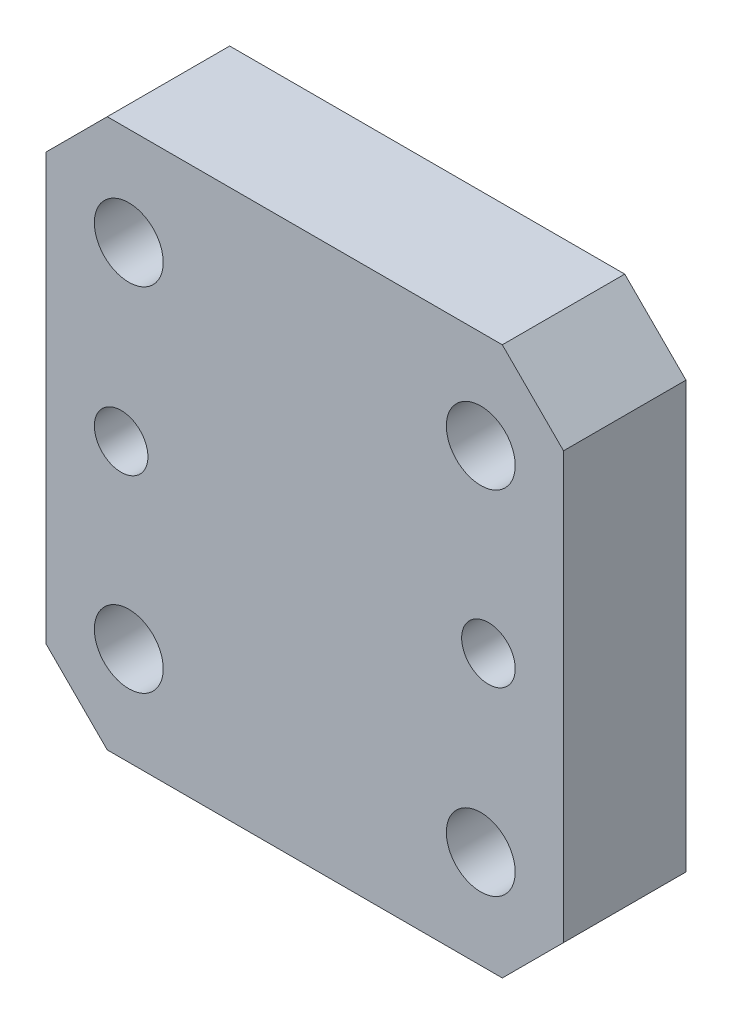
ISO-10303-21;
HEADER;
FILE_DESCRIPTION(('STEP AP214'),'2;1');
FILE_NAME('part.step','',(''),(''),'','','');
FILE_SCHEMA(('AUTOMOTIVE_DESIGN { 1 0 10303 214 1 1 1 1 }'));
ENDSEC;
DATA;
#1=APPLICATION_CONTEXT('core data for automotive mechanical design processes');
#2=APPLICATION_PROTOCOL_DEFINITION('international standard','automotive_design',2000,#1);
#3=PRODUCT_CONTEXT('',#1,'mechanical');
#4=PRODUCT('Part','Part','',(#3));
#5=PRODUCT_RELATED_PRODUCT_CATEGORY('part','',(#4));
#6=PRODUCT_DEFINITION_FORMATION('','',#4);
#7=PRODUCT_DEFINITION_CONTEXT('part definition',#1,'design');
#8=PRODUCT_DEFINITION('design','',#6,#7);
#9=PRODUCT_DEFINITION_SHAPE('','',#8);
#10=(LENGTH_UNIT() NAMED_UNIT(*) SI_UNIT(.MILLI.,.METRE.));
#11=(NAMED_UNIT(*) PLANE_ANGLE_UNIT() SI_UNIT($,.RADIAN.));
#12=(NAMED_UNIT(*) SI_UNIT($,.STERADIAN.) SOLID_ANGLE_UNIT());
#13=UNCERTAINTY_MEASURE_WITH_UNIT(LENGTH_MEASURE(1.E-05),#10,'distance_accuracy_value','');
#14=(GEOMETRIC_REPRESENTATION_CONTEXT(3) GLOBAL_UNCERTAINTY_ASSIGNED_CONTEXT((#13)) GLOBAL_UNIT_ASSIGNED_CONTEXT((#10,
#11,#12)) REPRESENTATION_CONTEXT('',''));
#15=CARTESIAN_POINT('',(0.,0.,0.));
#16=DIRECTION('',(0.,0.,1.));
#17=DIRECTION('',(1.,0.,0.));
#18=AXIS2_PLACEMENT_3D('',#15,#16,#17);
#19=CARTESIAN_POINT('',(-12.,0.,0.));
#20=DIRECTION('',(0.,0.,1.));
#21=DIRECTION('',(1.,0.,0.));
#22=AXIS2_PLACEMENT_3D('',#19,#20,#21);
#23=CYLINDRICAL_SURFACE('',#22,1.75);
#24=CARTESIAN_POINT('',(-12.,0.,8.));
#25=DIRECTION('',(0.,0.,1.));
#26=DIRECTION('',(1.,0.,0.));
#27=AXIS2_PLACEMENT_3D('',#24,#25,#26);
#28=CIRCLE('',#27,1.75);
#29=CARTESIAN_POINT('',(-10.25,0.,8.));
#30=VERTEX_POINT('',#29);
#31=EDGE_CURVE('E300',#30,#30,#28,.T.);
#32=ORIENTED_EDGE('',*,*,#31,.T.);
#33=EDGE_LOOP('',(#32));
#34=FACE_BOUND('',#33,.T.);
#35=CARTESIAN_POINT('',(-12.,0.,3.));
#36=DIRECTION('',(0.,0.,-1.));
#37=DIRECTION('',(-1.,0.,0.));
#38=AXIS2_PLACEMENT_3D('',#35,#36,#37);
#39=CIRCLE('',#38,1.75);
#40=CARTESIAN_POINT('',(-13.75,0.,3.));
#41=VERTEX_POINT('',#40);
#42=EDGE_CURVE('E37',#41,#41,#39,.F.);
#43=ORIENTED_EDGE('',*,*,#42,.F.);
#44=EDGE_LOOP('',(#43));
#45=FACE_BOUND('',#44,.T.);
#46=ADVANCED_FACE('F33',(#34,#45),#23,.F.);
#47=CARTESIAN_POINT('',(12.,0.,0.));
#48=DIRECTION('',(0.,0.,1.));
#49=DIRECTION('',(1.,0.,0.));
#50=AXIS2_PLACEMENT_3D('',#47,#48,#49);
#51=CYLINDRICAL_SURFACE('',#50,1.75);
#52=CARTESIAN_POINT('',(12.,0.,8.));
#53=DIRECTION('',(0.,0.,1.));
#54=DIRECTION('',(1.,0.,0.));
#55=AXIS2_PLACEMENT_3D('',#52,#53,#54);
#56=CIRCLE('',#55,1.75);
#57=CARTESIAN_POINT('',(13.75,0.,8.));
#58=VERTEX_POINT('',#57);
#59=EDGE_CURVE('E297',#58,#58,#56,.T.);
#60=ORIENTED_EDGE('',*,*,#59,.T.);
#61=EDGE_LOOP('',(#60));
#62=FACE_BOUND('',#61,.T.);
#63=CARTESIAN_POINT('',(12.,0.,3.));
#64=DIRECTION('',(0.,0.,-1.));
#65=DIRECTION('',(-1.,0.,0.));
#66=AXIS2_PLACEMENT_3D('',#63,#64,#65);
#67=CIRCLE('',#66,1.75);
#68=CARTESIAN_POINT('',(10.25,0.,3.));
#69=VERTEX_POINT('',#68);
#70=EDGE_CURVE('E263',#69,#69,#67,.F.);
#71=ORIENTED_EDGE('',*,*,#70,.F.);
#72=EDGE_LOOP('',(#71));
#73=FACE_BOUND('',#72,.T.);
#74=ADVANCED_FACE('F364',(#62,#73),#51,.F.);
#75=CARTESIAN_POINT('',(-16.9072825239631,17.9163073046844,8.));
#76=DIRECTION('',(1.,0.,0.));
#77=DIRECTION('',(0.,0.,-1.));
#78=AXIS2_PLACEMENT_3D('',#75,#76,#77);
#79=PLANE('',#78);
#80=DIRECTION('',(0.,-1.,0.));
#81=VECTOR('',#80,1.);
#82=CARTESIAN_POINT('',(-16.9072825239631,17.9163073046844,0.));
#83=LINE('',#82,#81);
#84=CARTESIAN_POINT('',(-16.9072825239631,13.9163073046844,0.));
#85=VERTEX_POINT('',#84);
#86=CARTESIAN_POINT('',(-16.9072825239631,-13.9163073046844,0.));
#87=VERTEX_POINT('',#86);
#88=EDGE_CURVE('E303',#85,#87,#83,.T.);
#89=ORIENTED_EDGE('',*,*,#88,.T.);
#90=DIRECTION('',(0.,0.,1.));
#91=VECTOR('',#90,1.);
#92=CARTESIAN_POINT('',(-16.9072825239631,-13.9163073046844,8.));
#93=LINE('',#92,#91);
#94=CARTESIAN_POINT('',(-16.9072825239631,-13.9163073046844,8.));
#95=VERTEX_POINT('',#94);
#96=EDGE_CURVE('E11',#87,#95,#93,.T.);
#97=ORIENTED_EDGE('',*,*,#96,.T.);
#98=DIRECTION('',(0.,-1.,0.));
#99=VECTOR('',#98,1.);
#100=CARTESIAN_POINT('',(-16.9072825239631,17.9163073046844,8.));
#101=LINE('',#100,#99);
#102=CARTESIAN_POINT('',(-16.9072825239631,13.9163073046844,8.));
#103=VERTEX_POINT('',#102);
#104=EDGE_CURVE('E304',#103,#95,#101,.T.);
#105=ORIENTED_EDGE('',*,*,#104,.F.);
#106=DIRECTION('',(0.,0.,-1.));
#107=VECTOR('',#106,1.);
#108=CARTESIAN_POINT('',(-16.9072825239631,13.9163073046844,8.));
#109=LINE('',#108,#107);
#110=EDGE_CURVE('E42',#103,#85,#109,.T.);
#111=ORIENTED_EDGE('',*,*,#110,.T.);
#112=EDGE_LOOP('',(#89,#97,#105,#111));
#113=FACE_BOUND('',#112,.T.);
#114=ADVANCED_FACE('F366',(#113),#79,.F.);
#115=CARTESIAN_POINT('',(16.9072825239631,-17.9163073046844,8.));
#116=DIRECTION('',(0.,1.,0.));
#117=DIRECTION('',(0.,0.,1.));
#118=AXIS2_PLACEMENT_3D('',#115,#116,#117);
#119=PLANE('',#118);
#120=DIRECTION('',(1.,0.,0.));
#121=VECTOR('',#120,1.);
#122=CARTESIAN_POINT('',(16.9072825239631,-17.9163073046844,0.));
#123=LINE('',#122,#121);
#124=CARTESIAN_POINT('',(-12.9072825239631,-17.9163073046844,0.));
#125=VERTEX_POINT('',#124);
#126=CARTESIAN_POINT('',(12.9072825239631,-17.9163073046844,0.));
#127=VERTEX_POINT('',#126);
#128=EDGE_CURVE('E320',#125,#127,#123,.T.);
#129=ORIENTED_EDGE('',*,*,#128,.T.);
#130=DIRECTION('',(0.,0.,1.));
#131=VECTOR('',#130,1.);
#132=CARTESIAN_POINT('',(12.9072825239631,-17.9163073046844,8.));
#133=LINE('',#132,#131);
#134=CARTESIAN_POINT('',(12.9072825239631,-17.9163073046844,8.));
#135=VERTEX_POINT('',#134);
#136=EDGE_CURVE('E356',#127,#135,#133,.T.);
#137=ORIENTED_EDGE('',*,*,#136,.T.);
#138=DIRECTION('',(1.,0.,0.));
#139=VECTOR('',#138,1.);
#140=CARTESIAN_POINT('',(16.9072825239631,-17.9163073046844,8.));
#141=LINE('',#140,#139);
#142=CARTESIAN_POINT('',(-12.9072825239631,-17.9163073046844,8.));
#143=VERTEX_POINT('',#142);
#144=EDGE_CURVE('E307',#143,#135,#141,.T.);
#145=ORIENTED_EDGE('',*,*,#144,.F.);
#146=DIRECTION('',(0.,0.,-1.));
#147=VECTOR('',#146,1.);
#148=CARTESIAN_POINT('',(-12.9072825239631,-17.9163073046844,8.));
#149=LINE('',#148,#147);
#150=EDGE_CURVE('E353',#143,#125,#149,.T.);
#151=ORIENTED_EDGE('',*,*,#150,.T.);
#152=EDGE_LOOP('',(#129,#137,#145,#151));
#153=FACE_BOUND('',#152,.T.);
#154=ADVANCED_FACE('F373',(#153),#119,.F.);
#155=CARTESIAN_POINT('',(16.9072825239631,17.9163073046844,8.));
#156=DIRECTION('',(-1.,0.,0.));
#157=DIRECTION('',(0.,0.,1.));
#158=AXIS2_PLACEMENT_3D('',#155,#156,#157);
#159=PLANE('',#158);
#160=DIRECTION('',(0.,1.,0.));
#161=VECTOR('',#160,1.);
#162=CARTESIAN_POINT('',(16.9072825239631,17.9163073046844,0.));
#163=LINE('',#162,#161);
#164=CARTESIAN_POINT('',(16.9072825239631,-13.9163073046844,0.));
#165=VERTEX_POINT('',#164);
#166=CARTESIAN_POINT('',(16.9072825239631,13.9163073046844,0.));
#167=VERTEX_POINT('',#166);
#168=EDGE_CURVE('E323',#165,#167,#163,.T.);
#169=ORIENTED_EDGE('',*,*,#168,.T.);
#170=DIRECTION('',(0.,0.,1.));
#171=VECTOR('',#170,1.);
#172=CARTESIAN_POINT('',(16.9072825239631,13.9163073046844,8.));
#173=LINE('',#172,#171);
#174=CARTESIAN_POINT('',(16.9072825239631,13.9163073046844,8.));
#175=VERTEX_POINT('',#174);
#176=EDGE_CURVE('E343',#167,#175,#173,.T.);
#177=ORIENTED_EDGE('',*,*,#176,.T.);
#178=DIRECTION('',(0.,1.,0.));
#179=VECTOR('',#178,1.);
#180=CARTESIAN_POINT('',(16.9072825239631,17.9163073046844,8.));
#181=LINE('',#180,#179);
#182=CARTESIAN_POINT('',(16.9072825239631,-13.9163073046844,8.));
#183=VERTEX_POINT('',#182);
#184=EDGE_CURVE('E311',#183,#175,#181,.T.);
#185=ORIENTED_EDGE('',*,*,#184,.F.);
#186=DIRECTION('',(0.,0.,-1.));
#187=VECTOR('',#186,1.);
#188=CARTESIAN_POINT('',(16.9072825239631,-13.9163073046844,8.));
#189=LINE('',#188,#187);
#190=EDGE_CURVE('E340',#183,#165,#189,.T.);
#191=ORIENTED_EDGE('',*,*,#190,.T.);
#192=EDGE_LOOP('',(#169,#177,#185,#191));
#193=FACE_BOUND('',#192,.T.);
#194=ADVANCED_FACE('F393',(#193),#159,.F.);
#195=CARTESIAN_POINT('',(16.9072825239631,17.9163073046844,8.));
#196=DIRECTION('',(0.,-1.,0.));
#197=DIRECTION('',(0.,0.,-1.));
#198=AXIS2_PLACEMENT_3D('',#195,#196,#197);
#199=PLANE('',#198);
#200=DIRECTION('',(-1.,0.,0.));
#201=VECTOR('',#200,1.);
#202=CARTESIAN_POINT('',(16.9072825239631,17.9163073046844,8.));
#203=LINE('',#202,#201);
#204=CARTESIAN_POINT('',(12.9072825239631,17.9163073046844,8.));
#205=VERTEX_POINT('',#204);
#206=CARTESIAN_POINT('',(-12.9072825239631,17.9163073046844,8.));
#207=VERTEX_POINT('',#206);
#208=EDGE_CURVE('E314',#205,#207,#203,.T.);
#209=ORIENTED_EDGE('',*,*,#208,.F.);
#210=DIRECTION('',(0.,0.,-1.));
#211=VECTOR('',#210,1.);
#212=CARTESIAN_POINT('',(12.9072825239631,17.9163073046844,8.));
#213=LINE('',#212,#211);
#214=CARTESIAN_POINT('',(12.9072825239631,17.9163073046844,0.));
#215=VERTEX_POINT('',#214);
#216=EDGE_CURVE('E329',#205,#215,#213,.T.);
#217=ORIENTED_EDGE('',*,*,#216,.T.);
#218=DIRECTION('',(-1.,0.,0.));
#219=VECTOR('',#218,1.);
#220=CARTESIAN_POINT('',(16.9072825239631,17.9163073046844,0.));
#221=LINE('',#220,#219);
#222=CARTESIAN_POINT('',(-12.9072825239631,17.9163073046844,0.));
#223=VERTEX_POINT('',#222);
#224=EDGE_CURVE('E308',#215,#223,#221,.T.);
#225=ORIENTED_EDGE('',*,*,#224,.T.);
#226=DIRECTION('',(0.,0.,1.));
#227=VECTOR('',#226,1.);
#228=CARTESIAN_POINT('',(-12.9072825239631,17.9163073046844,8.));
#229=LINE('',#228,#227);
#230=EDGE_CURVE('E317',#223,#207,#229,.T.);
#231=ORIENTED_EDGE('',*,*,#230,.T.);
#232=EDGE_LOOP('',(#209,#217,#225,#231));
#233=FACE_BOUND('',#232,.T.);
#234=ADVANCED_FACE('F386',(#233),#199,.F.);
#235=CARTESIAN_POINT('',(0.,0.,8.));
#236=DIRECTION('',(0.,0.,-1.));
#237=DIRECTION('',(-1.,0.,0.));
#238=AXIS2_PLACEMENT_3D('',#235,#236,#237);
#239=PLANE('',#238);
#240=CARTESIAN_POINT('',(11.5,-11.5000000000002,8.));
#241=DIRECTION('',(0.,0.,-1.));
#242=DIRECTION('',(-1.,0.,0.));
#243=AXIS2_PLACEMENT_3D('',#240,#241,#242);
#244=CIRCLE('',#243,2.25);
#245=CARTESIAN_POINT('',(9.25,-11.5000000000002,8.));
#246=VERTEX_POINT('',#245);
#247=EDGE_CURVE('E288',#246,#246,#244,.T.);
#248=ORIENTED_EDGE('',*,*,#247,.T.);
#249=EDGE_LOOP('',(#248));
#250=FACE_BOUND('',#249,.T.);
#251=CARTESIAN_POINT('',(11.5000000000001,11.4999999999998,8.));
#252=DIRECTION('',(0.,0.,-1.));
#253=DIRECTION('',(-1.,0.,0.));
#254=AXIS2_PLACEMENT_3D('',#251,#252,#253);
#255=CIRCLE('',#254,2.25);
#256=CARTESIAN_POINT('',(9.25000000000008,11.4999999999998,8.));
#257=VERTEX_POINT('',#256);
#258=EDGE_CURVE('E285',#257,#257,#255,.T.);
#259=ORIENTED_EDGE('',*,*,#258,.T.);
#260=EDGE_LOOP('',(#259));
#261=FACE_BOUND('',#260,.T.);
#262=CARTESIAN_POINT('',(-11.4999999999999,11.5,8.));
#263=DIRECTION('',(0.,0.,-1.));
#264=DIRECTION('',(-1.,0.,0.));
#265=AXIS2_PLACEMENT_3D('',#262,#263,#264);
#266=CIRCLE('',#265,2.25);
#267=CARTESIAN_POINT('',(-13.7499999999999,11.5,8.));
#268=VERTEX_POINT('',#267);
#269=EDGE_CURVE('E276',#268,#268,#266,.T.);
#270=ORIENTED_EDGE('',*,*,#269,.T.);
#271=EDGE_LOOP('',(#270));
#272=FACE_BOUND('',#271,.T.);
#273=CARTESIAN_POINT('',(-11.5,-11.5,8.));
#274=DIRECTION('',(0.,0.,-1.));
#275=DIRECTION('',(-1.,0.,0.));
#276=AXIS2_PLACEMENT_3D('',#273,#274,#275);
#277=CIRCLE('',#276,2.25);
#278=CARTESIAN_POINT('',(-13.75,-11.5,8.));
#279=VERTEX_POINT('',#278);
#280=EDGE_CURVE('E294',#279,#279,#277,.T.);
#281=ORIENTED_EDGE('',*,*,#280,.T.);
#282=EDGE_LOOP('',(#281));
#283=FACE_BOUND('',#282,.T.);
#284=ORIENTED_EDGE('',*,*,#59,.F.);
#285=EDGE_LOOP('',(#284));
#286=FACE_BOUND('',#285,.T.);
#287=ORIENTED_EDGE('',*,*,#31,.F.);
#288=EDGE_LOOP('',(#287));
#289=FACE_BOUND('',#288,.T.);
#290=ORIENTED_EDGE('',*,*,#184,.T.);
#291=DIRECTION('',(0.707106781186546,-0.707106781186549,0.));
#292=VECTOR('',#291,1.);
#293=CARTESIAN_POINT('',(12.9072825239631,17.9163073046844,8.));
#294=LINE('',#293,#292);
#295=EDGE_CURVE('E351',#175,#205,#294,.F.);
#296=ORIENTED_EDGE('',*,*,#295,.T.);
#297=ORIENTED_EDGE('',*,*,#208,.T.);
#298=DIRECTION('',(0.707106781186549,0.707106781186546,0.));
#299=VECTOR('',#298,1.);
#300=CARTESIAN_POINT('',(-16.9072825239631,13.9163073046844,8.));
#301=LINE('',#300,#299);
#302=EDGE_CURVE('E345',#207,#103,#301,.F.);
#303=ORIENTED_EDGE('',*,*,#302,.T.);
#304=ORIENTED_EDGE('',*,*,#104,.T.);
#305=DIRECTION('',(-0.707106781186546,0.707106781186549,0.));
#306=VECTOR('',#305,1.);
#307=CARTESIAN_POINT('',(-12.9072825239631,-17.9163073046844,8.));
#308=LINE('',#307,#306);
#309=EDGE_CURVE('E347',#95,#143,#308,.F.);
#310=ORIENTED_EDGE('',*,*,#309,.T.);
#311=ORIENTED_EDGE('',*,*,#144,.T.);
#312=DIRECTION('',(-0.707106781186549,-0.707106781186546,0.));
#313=VECTOR('',#312,1.);
#314=CARTESIAN_POINT('',(16.9072825239631,-13.9163073046844,8.));
#315=LINE('',#314,#313);
#316=EDGE_CURVE('E349',#135,#183,#315,.F.);
#317=ORIENTED_EDGE('',*,*,#316,.T.);
#318=EDGE_LOOP('',(#290,#296,#297,#303,#304,#310,#311,#317));
#319=FACE_BOUND('',#318,.T.);
#320=ADVANCED_FACE('F382',(#250,#261,#272,#283,#286,#289,#319),#239,.F.);
#321=CARTESIAN_POINT('',(0.,0.,0.));
#322=DIRECTION('',(0.,0.,-1.));
#323=DIRECTION('',(-1.,0.,0.));
#324=AXIS2_PLACEMENT_3D('',#321,#322,#323);
#325=PLANE('',#324);
#326=DIRECTION('',(-0.866025403784439,-0.5,0.));
#327=VECTOR('',#326,1.);
#328=CARTESIAN_POINT('',(-8.925,-1.7753520777581,0.));
#329=LINE('',#328,#327);
#330=CARTESIAN_POINT('',(-8.925,-1.7753520777581,0.));
#331=VERTEX_POINT('',#330);
#332=CARTESIAN_POINT('',(-12.,-3.5507041555162,0.));
#333=VERTEX_POINT('',#332);
#334=EDGE_CURVE('E50',#331,#333,#329,.T.);
#335=ORIENTED_EDGE('',*,*,#334,.F.);
#336=DIRECTION('',(0.,-1.,0.));
#337=VECTOR('',#336,1.);
#338=CARTESIAN_POINT('',(-8.925,1.7753520777581,0.));
#339=LINE('',#338,#337);
#340=CARTESIAN_POINT('',(-8.925,1.7753520777581,0.));
#341=VERTEX_POINT('',#340);
#342=EDGE_CURVE('E193',#341,#331,#339,.T.);
#343=ORIENTED_EDGE('',*,*,#342,.F.);
#344=DIRECTION('',(0.866025403784439,-0.5,0.));
#345=VECTOR('',#344,1.);
#346=CARTESIAN_POINT('',(-12.,3.5507041555162,0.));
#347=LINE('',#346,#345);
#348=CARTESIAN_POINT('',(-12.,3.5507041555162,0.));
#349=VERTEX_POINT('',#348);
#350=EDGE_CURVE('E196',#349,#341,#347,.T.);
#351=ORIENTED_EDGE('',*,*,#350,.F.);
#352=DIRECTION('',(0.866025403784439,0.5,0.));
#353=VECTOR('',#352,1.);
#354=CARTESIAN_POINT('',(-15.075,1.7753520777581,0.));
#355=LINE('',#354,#353);
#356=CARTESIAN_POINT('',(-15.075,1.7753520777581,0.));
#357=VERTEX_POINT('',#356);
#358=EDGE_CURVE('E212',#357,#349,#355,.T.);
#359=ORIENTED_EDGE('',*,*,#358,.F.);
#360=DIRECTION('',(0.,1.,0.));
#361=VECTOR('',#360,1.);
#362=CARTESIAN_POINT('',(-15.075,-1.7753520777581,0.));
#363=LINE('',#362,#361);
#364=CARTESIAN_POINT('',(-15.075,-1.7753520777581,0.));
#365=VERTEX_POINT('',#364);
#366=EDGE_CURVE('E209',#365,#357,#363,.T.);
#367=ORIENTED_EDGE('',*,*,#366,.F.);
#368=DIRECTION('',(-0.866025403784439,0.5,0.));
#369=VECTOR('',#368,1.);
#370=CARTESIAN_POINT('',(-12.,-3.5507041555162,0.));
#371=LINE('',#370,#369);
#372=EDGE_CURVE('E207',#333,#365,#371,.T.);
#373=ORIENTED_EDGE('',*,*,#372,.F.);
#374=EDGE_LOOP('',(#335,#343,#351,#359,#367,#373));
#375=FACE_BOUND('',#374,.T.);
#376=DIRECTION('',(-0.866025403784439,-0.5,0.));
#377=VECTOR('',#376,1.);
#378=CARTESIAN_POINT('',(15.075,-1.7753520777581,0.));
#379=LINE('',#378,#377);
#380=CARTESIAN_POINT('',(15.075,-1.7753520777581,0.));
#381=VERTEX_POINT('',#380);
#382=CARTESIAN_POINT('',(12.,-3.5507041555162,0.));
#383=VERTEX_POINT('',#382);
#384=EDGE_CURVE('E58',#381,#383,#379,.T.);
#385=ORIENTED_EDGE('',*,*,#384,.F.);
#386=DIRECTION('',(0.,-1.,0.));
#387=VECTOR('',#386,1.);
#388=CARTESIAN_POINT('',(15.075,1.7753520777581,0.));
#389=LINE('',#388,#387);
#390=CARTESIAN_POINT('',(15.075,1.7753520777581,0.));
#391=VERTEX_POINT('',#390);
#392=EDGE_CURVE('E230',#391,#381,#389,.T.);
#393=ORIENTED_EDGE('',*,*,#392,.F.);
#394=DIRECTION('',(0.866025403784439,-0.5,0.));
#395=VECTOR('',#394,1.);
#396=CARTESIAN_POINT('',(12.,3.5507041555162,0.));
#397=LINE('',#396,#395);
#398=CARTESIAN_POINT('',(12.,3.5507041555162,0.));
#399=VERTEX_POINT('',#398);
#400=EDGE_CURVE('E256',#399,#391,#397,.T.);
#401=ORIENTED_EDGE('',*,*,#400,.F.);
#402=DIRECTION('',(0.866025403784439,0.5,0.));
#403=VECTOR('',#402,1.);
#404=CARTESIAN_POINT('',(8.925,1.7753520777581,0.));
#405=LINE('',#404,#403);
#406=CARTESIAN_POINT('',(8.925,1.7753520777581,0.));
#407=VERTEX_POINT('',#406);
#408=EDGE_CURVE('E253',#407,#399,#405,.T.);
#409=ORIENTED_EDGE('',*,*,#408,.F.);
#410=DIRECTION('',(0.,1.,0.));
#411=VECTOR('',#410,1.);
#412=CARTESIAN_POINT('',(8.925,-1.7753520777581,0.));
#413=LINE('',#412,#411);
#414=CARTESIAN_POINT('',(8.925,-1.7753520777581,0.));
#415=VERTEX_POINT('',#414);
#416=EDGE_CURVE('E250',#415,#407,#413,.T.);
#417=ORIENTED_EDGE('',*,*,#416,.F.);
#418=DIRECTION('',(-0.866025403784439,0.5,0.));
#419=VECTOR('',#418,1.);
#420=CARTESIAN_POINT('',(12.,-3.5507041555162,0.));
#421=LINE('',#420,#419);
#422=EDGE_CURVE('E247',#383,#415,#421,.T.);
#423=ORIENTED_EDGE('',*,*,#422,.F.);
#424=EDGE_LOOP('',(#385,#393,#401,#409,#417,#423));
#425=FACE_BOUND('',#424,.T.);
#426=CARTESIAN_POINT('',(11.5,-11.5000000000002,0.));
#427=DIRECTION('',(0.,0.,-1.));
#428=DIRECTION('',(-1.,0.,0.));
#429=AXIS2_PLACEMENT_3D('',#426,#427,#428);
#430=CIRCLE('',#429,2.25);
#431=CARTESIAN_POINT('',(9.25,-11.5000000000002,0.));
#432=VERTEX_POINT('',#431);
#433=EDGE_CURVE('E273',#432,#432,#430,.T.);
#434=ORIENTED_EDGE('',*,*,#433,.F.);
#435=EDGE_LOOP('',(#434));
#436=FACE_BOUND('',#435,.T.);
#437=CARTESIAN_POINT('',(11.5000000000001,11.4999999999998,0.));
#438=DIRECTION('',(0.,0.,-1.));
#439=DIRECTION('',(-1.,0.,0.));
#440=AXIS2_PLACEMENT_3D('',#437,#438,#439);
#441=CIRCLE('',#440,2.25);
#442=CARTESIAN_POINT('',(9.25000000000008,11.4999999999998,0.));
#443=VERTEX_POINT('',#442);
#444=EDGE_CURVE('E277',#443,#443,#441,.T.);
#445=ORIENTED_EDGE('',*,*,#444,.F.);
#446=EDGE_LOOP('',(#445));
#447=FACE_BOUND('',#446,.T.);
#448=CARTESIAN_POINT('',(-11.4999999999999,11.5,0.));
#449=DIRECTION('',(0.,0.,-1.));
#450=DIRECTION('',(-1.,0.,0.));
#451=AXIS2_PLACEMENT_3D('',#448,#449,#450);
#452=CIRCLE('',#451,2.25);
#453=CARTESIAN_POINT('',(-13.7499999999999,11.5,0.));
#454=VERTEX_POINT('',#453);
#455=EDGE_CURVE('E280',#454,#454,#452,.T.);
#456=ORIENTED_EDGE('',*,*,#455,.F.);
#457=EDGE_LOOP('',(#456));
#458=FACE_BOUND('',#457,.T.);
#459=CARTESIAN_POINT('',(-11.5,-11.5,0.));
#460=DIRECTION('',(0.,0.,-1.));
#461=DIRECTION('',(-1.,0.,0.));
#462=AXIS2_PLACEMENT_3D('',#459,#460,#461);
#463=CIRCLE('',#462,2.25);
#464=CARTESIAN_POINT('',(-13.75,-11.5,0.));
#465=VERTEX_POINT('',#464);
#466=EDGE_CURVE('E291',#465,#465,#463,.T.);
#467=ORIENTED_EDGE('',*,*,#466,.F.);
#468=EDGE_LOOP('',(#467));
#469=FACE_BOUND('',#468,.T.);
#470=ORIENTED_EDGE('',*,*,#224,.F.);
#471=DIRECTION('',(-0.707106781186546,0.707106781186549,0.));
#472=VECTOR('',#471,1.);
#473=CARTESIAN_POINT('',(15.4117949143238,15.4117949143237,0.));
#474=LINE('',#473,#472);
#475=EDGE_CURVE('E338',#215,#167,#474,.F.);
#476=ORIENTED_EDGE('',*,*,#475,.T.);
#477=ORIENTED_EDGE('',*,*,#168,.F.);
#478=DIRECTION('',(0.707106781186549,0.707106781186546,0.));
#479=VECTOR('',#478,1.);
#480=CARTESIAN_POINT('',(15.4117949143237,-15.4117949143238,0.));
#481=LINE('',#480,#479);
#482=EDGE_CURVE('E336',#165,#127,#481,.F.);
#483=ORIENTED_EDGE('',*,*,#482,.T.);
#484=ORIENTED_EDGE('',*,*,#128,.F.);
#485=DIRECTION('',(0.707106781186546,-0.707106781186549,0.));
#486=VECTOR('',#485,1.);
#487=CARTESIAN_POINT('',(-15.4117949143238,-15.4117949143237,0.));
#488=LINE('',#487,#486);
#489=EDGE_CURVE('E334',#125,#87,#488,.F.);
#490=ORIENTED_EDGE('',*,*,#489,.T.);
#491=ORIENTED_EDGE('',*,*,#88,.F.);
#492=DIRECTION('',(-0.707106781186549,-0.707106781186546,0.));
#493=VECTOR('',#492,1.);
#494=CARTESIAN_POINT('',(-15.4117949143237,15.4117949143238,0.));
#495=LINE('',#494,#493);
#496=EDGE_CURVE('E332',#85,#223,#495,.F.);
#497=ORIENTED_EDGE('',*,*,#496,.T.);
#498=EDGE_LOOP('',(#470,#476,#477,#483,#484,#490,#491,#497));
#499=FACE_BOUND('',#498,.T.);
#500=ADVANCED_FACE('F385',(#375,#425,#436,#447,#458,#469,#499),#325,.T.);
#501=CARTESIAN_POINT('',(-11.5,-11.5,10.));
#502=DIRECTION('',(0.,0.,-1.));
#503=DIRECTION('',(-1.,0.,0.));
#504=AXIS2_PLACEMENT_3D('',#501,#502,#503);
#505=CYLINDRICAL_SURFACE('',#504,2.25);
#506=ORIENTED_EDGE('',*,*,#466,.T.);
#507=EDGE_LOOP('',(#506));
#508=FACE_BOUND('',#507,.T.);
#509=ORIENTED_EDGE('',*,*,#280,.F.);
#510=EDGE_LOOP('',(#509));
#511=FACE_BOUND('',#510,.T.);
#512=ADVANCED_FACE('F379',(#508,#511),#505,.F.);
#513=CARTESIAN_POINT('',(-11.4999999999999,11.5,10.));
#514=DIRECTION('',(0.,0.,-1.));
#515=DIRECTION('',(-1.,0.,0.));
#516=AXIS2_PLACEMENT_3D('',#513,#514,#515);
#517=CYLINDRICAL_SURFACE('',#516,2.25);
#518=ORIENTED_EDGE('',*,*,#455,.T.);
#519=EDGE_LOOP('',(#518));
#520=FACE_BOUND('',#519,.T.);
#521=ORIENTED_EDGE('',*,*,#269,.F.);
#522=EDGE_LOOP('',(#521));
#523=FACE_BOUND('',#522,.T.);
#524=ADVANCED_FACE('F476',(#520,#523),#517,.F.);
#525=CARTESIAN_POINT('',(11.5000000000001,11.4999999999998,10.));
#526=DIRECTION('',(0.,0.,-1.));
#527=DIRECTION('',(-1.,0.,0.));
#528=AXIS2_PLACEMENT_3D('',#525,#526,#527);
#529=CYLINDRICAL_SURFACE('',#528,2.25);
#530=ORIENTED_EDGE('',*,*,#444,.T.);
#531=EDGE_LOOP('',(#530));
#532=FACE_BOUND('',#531,.T.);
#533=ORIENTED_EDGE('',*,*,#258,.F.);
#534=EDGE_LOOP('',(#533));
#535=FACE_BOUND('',#534,.T.);
#536=ADVANCED_FACE('F473',(#532,#535),#529,.F.);
#537=CARTESIAN_POINT('',(11.5,-11.5000000000002,10.));
#538=DIRECTION('',(0.,0.,-1.));
#539=DIRECTION('',(-1.,0.,0.));
#540=AXIS2_PLACEMENT_3D('',#537,#538,#539);
#541=CYLINDRICAL_SURFACE('',#540,2.25);
#542=ORIENTED_EDGE('',*,*,#433,.T.);
#543=EDGE_LOOP('',(#542));
#544=FACE_BOUND('',#543,.T.);
#545=ORIENTED_EDGE('',*,*,#247,.F.);
#546=EDGE_LOOP('',(#545));
#547=FACE_BOUND('',#546,.T.);
#548=ADVANCED_FACE('F405',(#544,#547),#541,.F.);
#549=CARTESIAN_POINT('',(12.9072825239631,17.9163073046844,8.));
#550=DIRECTION('',(-0.707106781186549,-0.707106781186546,0.));
#551=DIRECTION('',(0.,0.,-1.));
#552=AXIS2_PLACEMENT_3D('',#549,#550,#551);
#553=PLANE('',#552);
#554=ORIENTED_EDGE('',*,*,#295,.F.);
#555=ORIENTED_EDGE('',*,*,#176,.F.);
#556=ORIENTED_EDGE('',*,*,#475,.F.);
#557=ORIENTED_EDGE('',*,*,#216,.F.);
#558=EDGE_LOOP('',(#554,#555,#556,#557));
#559=FACE_BOUND('',#558,.T.);
#560=ADVANCED_FACE('F401',(#559),#553,.F.);
#561=CARTESIAN_POINT('',(16.9072825239631,-13.9163073046844,8.));
#562=DIRECTION('',(-0.707106781186546,0.707106781186549,0.));
#563=DIRECTION('',(0.,0.,-1.));
#564=AXIS2_PLACEMENT_3D('',#561,#562,#563);
#565=PLANE('',#564);
#566=ORIENTED_EDGE('',*,*,#316,.F.);
#567=ORIENTED_EDGE('',*,*,#136,.F.);
#568=ORIENTED_EDGE('',*,*,#482,.F.);
#569=ORIENTED_EDGE('',*,*,#190,.F.);
#570=EDGE_LOOP('',(#566,#567,#568,#569));
#571=FACE_BOUND('',#570,.T.);
#572=ADVANCED_FACE('F404',(#571),#565,.F.);
#573=CARTESIAN_POINT('',(-12.9072825239631,-17.9163073046844,8.));
#574=DIRECTION('',(0.707106781186549,0.707106781186546,0.));
#575=DIRECTION('',(0.,0.,-1.));
#576=AXIS2_PLACEMENT_3D('',#573,#574,#575);
#577=PLANE('',#576);
#578=ORIENTED_EDGE('',*,*,#309,.F.);
#579=ORIENTED_EDGE('',*,*,#96,.F.);
#580=ORIENTED_EDGE('',*,*,#489,.F.);
#581=ORIENTED_EDGE('',*,*,#150,.F.);
#582=EDGE_LOOP('',(#578,#579,#580,#581));
#583=FACE_BOUND('',#582,.T.);
#584=ADVANCED_FACE('F408',(#583),#577,.F.);
#585=CARTESIAN_POINT('',(-16.9072825239631,13.9163073046844,8.));
#586=DIRECTION('',(0.707106781186546,-0.707106781186549,0.));
#587=DIRECTION('',(0.,0.,-1.));
#588=AXIS2_PLACEMENT_3D('',#585,#586,#587);
#589=PLANE('',#588);
#590=ORIENTED_EDGE('',*,*,#302,.F.);
#591=ORIENTED_EDGE('',*,*,#230,.F.);
#592=ORIENTED_EDGE('',*,*,#496,.F.);
#593=ORIENTED_EDGE('',*,*,#110,.F.);
#594=EDGE_LOOP('',(#590,#591,#592,#593));
#595=FACE_BOUND('',#594,.T.);
#596=ADVANCED_FACE('F35',(#595),#589,.F.);
#597=CARTESIAN_POINT('',(0.,0.,3.));
#598=DIRECTION('',(0.,0.,-1.));
#599=DIRECTION('',(-1.,0.,0.));
#600=AXIS2_PLACEMENT_3D('',#597,#598,#599);
#601=PLANE('',#600);
#602=DIRECTION('',(-0.866025403784439,-0.5,0.));
#603=VECTOR('',#602,1.);
#604=CARTESIAN_POINT('',(15.075,-1.7753520777581,3.));
#605=LINE('',#604,#603);
#606=CARTESIAN_POINT('',(15.075,-1.7753520777581,3.));
#607=VERTEX_POINT('',#606);
#608=CARTESIAN_POINT('',(12.,-3.5507041555162,3.));
#609=VERTEX_POINT('',#608);
#610=EDGE_CURVE('E226',#607,#609,#605,.T.);
#611=ORIENTED_EDGE('',*,*,#610,.T.);
#612=DIRECTION('',(-0.866025403784439,0.5,0.));
#613=VECTOR('',#612,1.);
#614=CARTESIAN_POINT('',(12.,-3.5507041555162,3.));
#615=LINE('',#614,#613);
#616=CARTESIAN_POINT('',(8.925,-1.7753520777581,3.));
#617=VERTEX_POINT('',#616);
#618=EDGE_CURVE('E229',#609,#617,#615,.T.);
#619=ORIENTED_EDGE('',*,*,#618,.T.);
#620=DIRECTION('',(0.,1.,0.));
#621=VECTOR('',#620,1.);
#622=CARTESIAN_POINT('',(8.925,-1.7753520777581,3.));
#623=LINE('',#622,#621);
#624=CARTESIAN_POINT('',(8.925,1.7753520777581,3.));
#625=VERTEX_POINT('',#624);
#626=EDGE_CURVE('E233',#617,#625,#623,.T.);
#627=ORIENTED_EDGE('',*,*,#626,.T.);
#628=DIRECTION('',(0.866025403784439,0.5,0.));
#629=VECTOR('',#628,1.);
#630=CARTESIAN_POINT('',(8.925,1.7753520777581,3.));
#631=LINE('',#630,#629);
#632=CARTESIAN_POINT('',(12.,3.5507041555162,3.));
#633=VERTEX_POINT('',#632);
#634=EDGE_CURVE('E236',#625,#633,#631,.T.);
#635=ORIENTED_EDGE('',*,*,#634,.T.);
#636=DIRECTION('',(0.866025403784439,-0.5,0.));
#637=VECTOR('',#636,1.);
#638=CARTESIAN_POINT('',(12.,3.5507041555162,3.));
#639=LINE('',#638,#637);
#640=CARTESIAN_POINT('',(15.075,1.7753520777581,3.));
#641=VERTEX_POINT('',#640);
#642=EDGE_CURVE('E239',#633,#641,#639,.T.);
#643=ORIENTED_EDGE('',*,*,#642,.T.);
#644=DIRECTION('',(0.,-1.,0.));
#645=VECTOR('',#644,1.);
#646=CARTESIAN_POINT('',(15.075,1.7753520777581,3.));
#647=LINE('',#646,#645);
#648=EDGE_CURVE('E242',#641,#607,#647,.T.);
#649=ORIENTED_EDGE('',*,*,#648,.T.);
#650=EDGE_LOOP('',(#611,#619,#627,#635,#643,#649));
#651=FACE_BOUND('',#650,.T.);
#652=ORIENTED_EDGE('',*,*,#70,.T.);
#653=EDGE_LOOP('',(#652));
#654=FACE_BOUND('',#653,.T.);
#655=ADVANCED_FACE('F362',(#651,#654),#601,.T.);
#656=CARTESIAN_POINT('',(15.075,-1.7753520777581,3.));
#657=DIRECTION('',(0.5,-0.866025403784438,0.));
#658=DIRECTION('',(0.866025403784439,0.5,0.));
#659=AXIS2_PLACEMENT_3D('',#656,#657,#658);
#660=PLANE('',#659);
#661=ORIENTED_EDGE('',*,*,#384,.T.);
#662=DIRECTION('',(0.,0.,-1.));
#663=VECTOR('',#662,1.);
#664=CARTESIAN_POINT('',(12.,-3.5507041555162,3.));
#665=LINE('',#664,#663);
#666=EDGE_CURVE('E245',#609,#383,#665,.T.);
#667=ORIENTED_EDGE('',*,*,#666,.F.);
#668=ORIENTED_EDGE('',*,*,#610,.F.);
#669=DIRECTION('',(0.,0.,-1.));
#670=VECTOR('',#669,1.);
#671=CARTESIAN_POINT('',(15.075,-1.7753520777581,3.));
#672=LINE('',#671,#670);
#673=EDGE_CURVE('E261',#607,#381,#672,.T.);
#674=ORIENTED_EDGE('',*,*,#673,.T.);
#675=EDGE_LOOP('',(#661,#667,#668,#674));
#676=FACE_BOUND('',#675,.T.);
#677=ADVANCED_FACE('F441',(#676),#660,.F.);
#678=CARTESIAN_POINT('',(15.075,1.7753520777581,3.));
#679=DIRECTION('',(1.,0.,0.));
#680=DIRECTION('',(0.,0.,-1.));
#681=AXIS2_PLACEMENT_3D('',#678,#679,#680);
#682=PLANE('',#681);
#683=ORIENTED_EDGE('',*,*,#392,.T.);
#684=ORIENTED_EDGE('',*,*,#673,.F.);
#685=ORIENTED_EDGE('',*,*,#648,.F.);
#686=DIRECTION('',(0.,0.,-1.));
#687=VECTOR('',#686,1.);
#688=CARTESIAN_POINT('',(15.075,1.7753520777581,3.));
#689=LINE('',#688,#687);
#690=EDGE_CURVE('E264',#641,#391,#689,.T.);
#691=ORIENTED_EDGE('',*,*,#690,.T.);
#692=EDGE_LOOP('',(#683,#684,#685,#691));
#693=FACE_BOUND('',#692,.T.);
#694=ADVANCED_FACE('F447',(#693),#682,.F.);
#695=CARTESIAN_POINT('',(12.,3.5507041555162,3.));
#696=DIRECTION('',(0.5,0.866025403784438,0.));
#697=DIRECTION('',(-0.866025403784439,0.5,0.));
#698=AXIS2_PLACEMENT_3D('',#695,#696,#697);
#699=PLANE('',#698);
#700=ORIENTED_EDGE('',*,*,#400,.T.);
#701=ORIENTED_EDGE('',*,*,#690,.F.);
#702=ORIENTED_EDGE('',*,*,#642,.F.);
#703=DIRECTION('',(0.,0.,-1.));
#704=VECTOR('',#703,1.);
#705=CARTESIAN_POINT('',(12.,3.5507041555162,3.));
#706=LINE('',#705,#704);
#707=EDGE_CURVE('E266',#633,#399,#706,.T.);
#708=ORIENTED_EDGE('',*,*,#707,.T.);
#709=EDGE_LOOP('',(#700,#701,#702,#708));
#710=FACE_BOUND('',#709,.T.);
#711=ADVANCED_FACE('F454',(#710),#699,.F.);
#712=CARTESIAN_POINT('',(8.925,1.7753520777581,3.));
#713=DIRECTION('',(-0.5,0.866025403784439,0.));
#714=DIRECTION('',(-0.866025403784439,-0.5,0.));
#715=AXIS2_PLACEMENT_3D('',#712,#713,#714);
#716=PLANE('',#715);
#717=ORIENTED_EDGE('',*,*,#408,.T.);
#718=ORIENTED_EDGE('',*,*,#707,.F.);
#719=ORIENTED_EDGE('',*,*,#634,.F.);
#720=DIRECTION('',(0.,0.,-1.));
#721=VECTOR('',#720,1.);
#722=CARTESIAN_POINT('',(8.925,1.7753520777581,3.));
#723=LINE('',#722,#721);
#724=EDGE_CURVE('E268',#625,#407,#723,.T.);
#725=ORIENTED_EDGE('',*,*,#724,.T.);
#726=EDGE_LOOP('',(#717,#718,#719,#725));
#727=FACE_BOUND('',#726,.T.);
#728=ADVANCED_FACE('F458',(#727),#716,.F.);
#729=CARTESIAN_POINT('',(8.925,-1.7753520777581,3.));
#730=DIRECTION('',(-1.,0.,0.));
#731=DIRECTION('',(0.,0.,1.));
#732=AXIS2_PLACEMENT_3D('',#729,#730,#731);
#733=PLANE('',#732);
#734=ORIENTED_EDGE('',*,*,#416,.T.);
#735=ORIENTED_EDGE('',*,*,#724,.F.);
#736=ORIENTED_EDGE('',*,*,#626,.F.);
#737=DIRECTION('',(0.,0.,-1.));
#738=VECTOR('',#737,1.);
#739=CARTESIAN_POINT('',(8.925,-1.7753520777581,3.));
#740=LINE('',#739,#738);
#741=EDGE_CURVE('E270',#617,#415,#740,.T.);
#742=ORIENTED_EDGE('',*,*,#741,.T.);
#743=EDGE_LOOP('',(#734,#735,#736,#742));
#744=FACE_BOUND('',#743,.T.);
#745=ADVANCED_FACE('F462',(#744),#733,.F.);
#746=CARTESIAN_POINT('',(12.,-3.5507041555162,3.));
#747=DIRECTION('',(-0.5,-0.866025403784439,0.));
#748=DIRECTION('',(0.866025403784439,-0.5,0.));
#749=AXIS2_PLACEMENT_3D('',#746,#747,#748);
#750=PLANE('',#749);
#751=ORIENTED_EDGE('',*,*,#422,.T.);
#752=ORIENTED_EDGE('',*,*,#741,.F.);
#753=ORIENTED_EDGE('',*,*,#618,.F.);
#754=ORIENTED_EDGE('',*,*,#666,.T.);
#755=EDGE_LOOP('',(#751,#752,#753,#754));
#756=FACE_BOUND('',#755,.T.);
#757=ADVANCED_FACE('F466',(#756),#750,.F.);
#758=CARTESIAN_POINT('',(0.,0.,3.));
#759=DIRECTION('',(0.,0.,-1.));
#760=DIRECTION('',(-1.,0.,0.));
#761=AXIS2_PLACEMENT_3D('',#758,#759,#760);
#762=PLANE('',#761);
#763=DIRECTION('',(-0.866025403784439,-0.5,0.));
#764=VECTOR('',#763,1.);
#765=CARTESIAN_POINT('',(-8.925,-1.7753520777581,3.));
#766=LINE('',#765,#764);
#767=CARTESIAN_POINT('',(-8.925,-1.7753520777581,3.));
#768=VERTEX_POINT('',#767);
#769=CARTESIAN_POINT('',(-12.,-3.5507041555162,3.));
#770=VERTEX_POINT('',#769);
#771=EDGE_CURVE('E173',#768,#770,#766,.T.);
#772=ORIENTED_EDGE('',*,*,#771,.T.);
#773=DIRECTION('',(-0.866025403784439,0.5,0.));
#774=VECTOR('',#773,1.);
#775=CARTESIAN_POINT('',(-12.,-3.5507041555162,3.));
#776=LINE('',#775,#774);
#777=CARTESIAN_POINT('',(-15.075,-1.7753520777581,3.));
#778=VERTEX_POINT('',#777);
#779=EDGE_CURVE('E182',#770,#778,#776,.T.);
#780=ORIENTED_EDGE('',*,*,#779,.T.);
#781=DIRECTION('',(0.,1.,0.));
#782=VECTOR('',#781,1.);
#783=CARTESIAN_POINT('',(-15.075,-1.7753520777581,3.));
#784=LINE('',#783,#782);
#785=CARTESIAN_POINT('',(-15.075,1.7753520777581,3.));
#786=VERTEX_POINT('',#785);
#787=EDGE_CURVE('E187',#778,#786,#784,.T.);
#788=ORIENTED_EDGE('',*,*,#787,.T.);
#789=DIRECTION('',(0.866025403784439,0.5,0.));
#790=VECTOR('',#789,1.);
#791=CARTESIAN_POINT('',(-15.075,1.7753520777581,3.));
#792=LINE('',#791,#790);
#793=CARTESIAN_POINT('',(-12.,3.5507041555162,3.));
#794=VERTEX_POINT('',#793);
#795=EDGE_CURVE('E200',#786,#794,#792,.T.);
#796=ORIENTED_EDGE('',*,*,#795,.T.);
#797=DIRECTION('',(0.866025403784439,-0.5,0.));
#798=VECTOR('',#797,1.);
#799=CARTESIAN_POINT('',(-12.,3.5507041555162,3.));
#800=LINE('',#799,#798);
#801=CARTESIAN_POINT('',(-8.925,1.7753520777581,3.));
#802=VERTEX_POINT('',#801);
#803=EDGE_CURVE('E203',#794,#802,#800,.T.);
#804=ORIENTED_EDGE('',*,*,#803,.T.);
#805=DIRECTION('',(0.,-1.,0.));
#806=VECTOR('',#805,1.);
#807=CARTESIAN_POINT('',(-8.925,1.7753520777581,3.));
#808=LINE('',#807,#806);
#809=EDGE_CURVE('E179',#802,#768,#808,.T.);
#810=ORIENTED_EDGE('',*,*,#809,.T.);
#811=EDGE_LOOP('',(#772,#780,#788,#796,#804,#810));
#812=FACE_BOUND('',#811,.T.);
#813=ORIENTED_EDGE('',*,*,#42,.T.);
#814=EDGE_LOOP('',(#813));
#815=FACE_BOUND('',#814,.T.);
#816=ADVANCED_FACE('F189',(#812,#815),#762,.T.);
#817=CARTESIAN_POINT('',(-8.925,-1.7753520777581,3.));
#818=DIRECTION('',(0.5,-0.866025403784438,0.));
#819=DIRECTION('',(0.866025403784439,0.5,0.));
#820=AXIS2_PLACEMENT_3D('',#817,#818,#819);
#821=PLANE('',#820);
#822=ORIENTED_EDGE('',*,*,#334,.T.);
#823=DIRECTION('',(0.,0.,-1.));
#824=VECTOR('',#823,1.);
#825=CARTESIAN_POINT('',(-12.,-3.5507041555162,3.));
#826=LINE('',#825,#824);
#827=EDGE_CURVE('E169',#770,#333,#826,.T.);
#828=ORIENTED_EDGE('',*,*,#827,.F.);
#829=ORIENTED_EDGE('',*,*,#771,.F.);
#830=DIRECTION('',(0.,0.,-1.));
#831=VECTOR('',#830,1.);
#832=CARTESIAN_POINT('',(-8.925,-1.7753520777581,3.));
#833=LINE('',#832,#831);
#834=EDGE_CURVE('E217',#768,#331,#833,.T.);
#835=ORIENTED_EDGE('',*,*,#834,.T.);
#836=EDGE_LOOP('',(#822,#828,#829,#835));
#837=FACE_BOUND('',#836,.T.);
#838=ADVANCED_FACE('F171',(#837),#821,.F.);
#839=CARTESIAN_POINT('',(-8.925,1.7753520777581,3.));
#840=DIRECTION('',(1.,0.,0.));
#841=DIRECTION('',(0.,0.,-1.));
#842=AXIS2_PLACEMENT_3D('',#839,#840,#841);
#843=PLANE('',#842);
#844=ORIENTED_EDGE('',*,*,#342,.T.);
#845=ORIENTED_EDGE('',*,*,#834,.F.);
#846=ORIENTED_EDGE('',*,*,#809,.F.);
#847=DIRECTION('',(0.,0.,-1.));
#848=VECTOR('',#847,1.);
#849=CARTESIAN_POINT('',(-8.925,1.7753520777581,3.));
#850=LINE('',#849,#848);
#851=EDGE_CURVE('E219',#802,#341,#850,.T.);
#852=ORIENTED_EDGE('',*,*,#851,.T.);
#853=EDGE_LOOP('',(#844,#845,#846,#852));
#854=FACE_BOUND('',#853,.T.);
#855=ADVANCED_FACE('F502',(#854),#843,.F.);
#856=CARTESIAN_POINT('',(-12.,3.5507041555162,3.));
#857=DIRECTION('',(0.5,0.866025403784439,0.));
#858=DIRECTION('',(-0.866025403784439,0.5,0.));
#859=AXIS2_PLACEMENT_3D('',#856,#857,#858);
#860=PLANE('',#859);
#861=ORIENTED_EDGE('',*,*,#350,.T.);
#862=ORIENTED_EDGE('',*,*,#851,.F.);
#863=ORIENTED_EDGE('',*,*,#803,.F.);
#864=DIRECTION('',(0.,0.,-1.));
#865=VECTOR('',#864,1.);
#866=CARTESIAN_POINT('',(-12.,3.5507041555162,3.));
#867=LINE('',#866,#865);
#868=EDGE_CURVE('E221',#794,#349,#867,.T.);
#869=ORIENTED_EDGE('',*,*,#868,.T.);
#870=EDGE_LOOP('',(#861,#862,#863,#869));
#871=FACE_BOUND('',#870,.T.);
#872=ADVANCED_FACE('F506',(#871),#860,.F.);
#873=CARTESIAN_POINT('',(-15.075,1.7753520777581,3.));
#874=DIRECTION('',(-0.5,0.866025403784439,0.));
#875=DIRECTION('',(-0.866025403784439,-0.5,0.));
#876=AXIS2_PLACEMENT_3D('',#873,#874,#875);
#877=PLANE('',#876);
#878=ORIENTED_EDGE('',*,*,#358,.T.);
#879=ORIENTED_EDGE('',*,*,#868,.F.);
#880=ORIENTED_EDGE('',*,*,#795,.F.);
#881=DIRECTION('',(0.,0.,-1.));
#882=VECTOR('',#881,1.);
#883=CARTESIAN_POINT('',(-15.075,1.7753520777581,3.));
#884=LINE('',#883,#882);
#885=EDGE_CURVE('E223',#786,#357,#884,.T.);
#886=ORIENTED_EDGE('',*,*,#885,.T.);
#887=EDGE_LOOP('',(#878,#879,#880,#886));
#888=FACE_BOUND('',#887,.T.);
#889=ADVANCED_FACE('F510',(#888),#877,.F.);
#890=CARTESIAN_POINT('',(-15.075,-1.7753520777581,3.));
#891=DIRECTION('',(-1.,0.,0.));
#892=DIRECTION('',(0.,0.,1.));
#893=AXIS2_PLACEMENT_3D('',#890,#891,#892);
#894=PLANE('',#893);
#895=ORIENTED_EDGE('',*,*,#366,.T.);
#896=ORIENTED_EDGE('',*,*,#885,.F.);
#897=ORIENTED_EDGE('',*,*,#787,.F.);
#898=DIRECTION('',(0.,0.,-1.));
#899=VECTOR('',#898,1.);
#900=CARTESIAN_POINT('',(-15.075,-1.7753520777581,3.));
#901=LINE('',#900,#899);
#902=EDGE_CURVE('E178',#778,#365,#901,.T.);
#903=ORIENTED_EDGE('',*,*,#902,.T.);
#904=EDGE_LOOP('',(#895,#896,#897,#903));
#905=FACE_BOUND('',#904,.T.);
#906=ADVANCED_FACE('F514',(#905),#894,.F.);
#907=CARTESIAN_POINT('',(-12.,-3.5507041555162,3.));
#908=DIRECTION('',(-0.5,-0.866025403784439,0.));
#909=DIRECTION('',(0.866025403784439,-0.5,0.));
#910=AXIS2_PLACEMENT_3D('',#907,#908,#909);
#911=PLANE('',#910);
#912=ORIENTED_EDGE('',*,*,#372,.T.);
#913=ORIENTED_EDGE('',*,*,#902,.F.);
#914=ORIENTED_EDGE('',*,*,#779,.F.);
#915=ORIENTED_EDGE('',*,*,#827,.T.);
#916=EDGE_LOOP('',(#912,#913,#914,#915));
#917=FACE_BOUND('',#916,.T.);
#918=ADVANCED_FACE('F183',(#917),#911,.F.);
#919=CLOSED_SHELL('',(#46,#74,#114,#154,#194,#234,#320,#500,#512,#524,#536,#548,#560,#572,#584,
#596,#655,#677,#694,#711,#728,#745,#757,#816,#838,#855,#872,#889,#906,#918));
#920=MANIFOLD_SOLID_BREP('B2',#919);
#921=ADVANCED_BREP_SHAPE_REPRESENTATION('',(#18,#920),#14);
#922=SHAPE_DEFINITION_REPRESENTATION(#9,#921);
ENDSEC;
END-ISO-10303-21;
